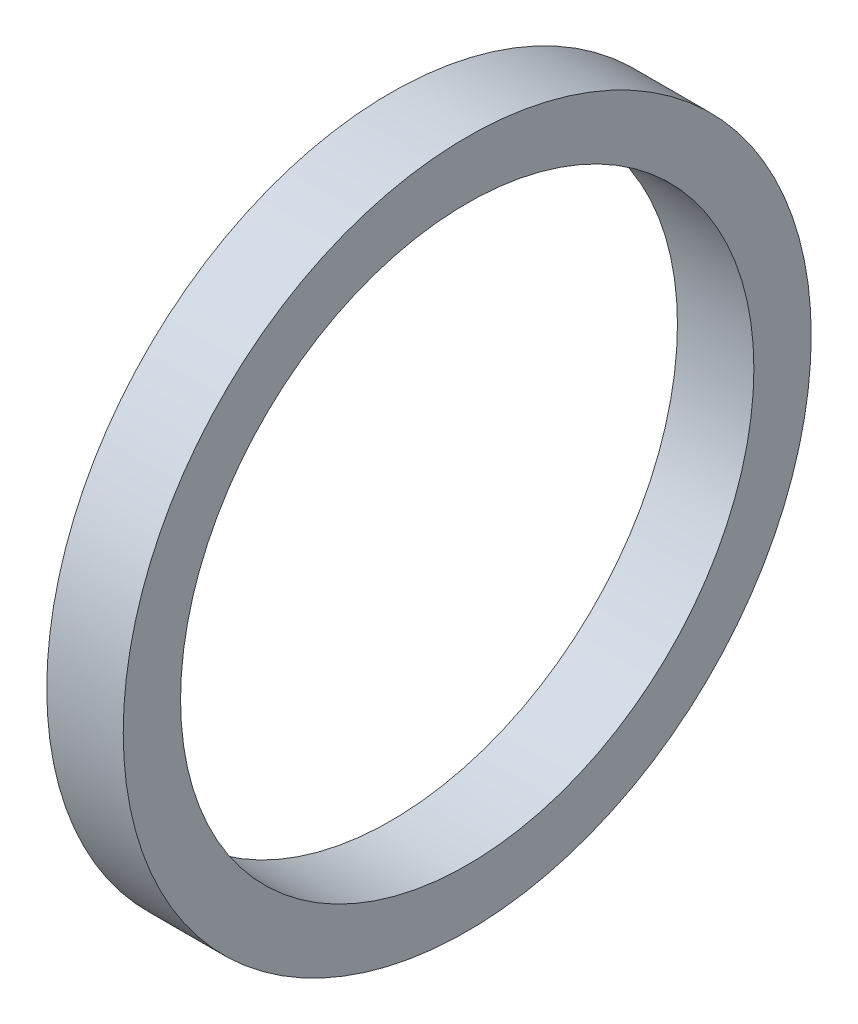
ISO-10303-21;
HEADER;
FILE_DESCRIPTION(('STEP AP214'),'2;1');
FILE_NAME('part.step','',(''),(''),'','','');
FILE_SCHEMA(('AUTOMOTIVE_DESIGN { 1 0 10303 214 1 1 1 1 }'));
ENDSEC;
DATA;
#1=APPLICATION_CONTEXT('core data for automotive mechanical design processes');
#2=APPLICATION_PROTOCOL_DEFINITION('international standard','automotive_design',2000,#1);
#3=PRODUCT_CONTEXT('',#1,'mechanical');
#4=PRODUCT('Part','Part','',(#3));
#5=PRODUCT_RELATED_PRODUCT_CATEGORY('part','',(#4));
#6=PRODUCT_DEFINITION_FORMATION('','',#4);
#7=PRODUCT_DEFINITION_CONTEXT('part definition',#1,'design');
#8=PRODUCT_DEFINITION('design','',#6,#7);
#9=PRODUCT_DEFINITION_SHAPE('','',#8);
#10=(LENGTH_UNIT() NAMED_UNIT(*) SI_UNIT(.MILLI.,.METRE.));
#11=(NAMED_UNIT(*) PLANE_ANGLE_UNIT() SI_UNIT($,.RADIAN.));
#12=(NAMED_UNIT(*) SI_UNIT($,.STERADIAN.) SOLID_ANGLE_UNIT());
#13=UNCERTAINTY_MEASURE_WITH_UNIT(LENGTH_MEASURE(1.E-05),#10,'distance_accuracy_value','');
#14=(GEOMETRIC_REPRESENTATION_CONTEXT(3) GLOBAL_UNCERTAINTY_ASSIGNED_CONTEXT((#13)) GLOBAL_UNIT_ASSIGNED_CONTEXT((#10,
#11,#12)) REPRESENTATION_CONTEXT('',''));
#15=CARTESIAN_POINT('',(0.,0.,0.));
#16=DIRECTION('',(0.,0.,1.));
#17=DIRECTION('',(1.,0.,0.));
#18=AXIS2_PLACEMENT_3D('',#15,#16,#17);
#19=CARTESIAN_POINT('',(0.,45.,0.));
#20=DIRECTION('',(1.,0.,0.));
#21=DIRECTION('',(0.,0.,-1.));
#22=AXIS2_PLACEMENT_3D('',#19,#20,#21);
#23=PLANE('',#22);
#24=CARTESIAN_POINT('',(0.,0.,0.));
#25=DIRECTION('',(-1.,0.,0.));
#26=DIRECTION('',(0.,0.,1.));
#27=AXIS2_PLACEMENT_3D('',#24,#25,#26);
#28=CIRCLE('',#27,37.5);
#29=CARTESIAN_POINT('',(0.,0.,37.5));
#30=VERTEX_POINT('',#29);
#31=EDGE_CURVE('E10',#30,#30,#28,.T.);
#32=ORIENTED_EDGE('',*,*,#31,.F.);
#33=EDGE_LOOP('',(#32));
#34=FACE_BOUND('',#33,.T.);
#35=CARTESIAN_POINT('',(0.,0.,0.));
#36=DIRECTION('',(-1.,0.,0.));
#37=DIRECTION('',(0.,0.,1.));
#38=AXIS2_PLACEMENT_3D('',#35,#36,#37);
#39=CIRCLE('',#38,45.);
#40=CARTESIAN_POINT('',(0.,0.,45.));
#41=VERTEX_POINT('',#40);
#42=EDGE_CURVE('E54',#41,#41,#39,.T.);
#43=ORIENTED_EDGE('',*,*,#42,.T.);
#44=EDGE_LOOP('',(#43));
#45=FACE_BOUND('',#44,.T.);
#46=ADVANCED_FACE('F41',(#34,#45),#23,.F.);
#47=CARTESIAN_POINT('',(-59.6592581066923,0.,0.));
#48=DIRECTION('',(-1.,0.,0.));
#49=DIRECTION('',(0.,0.,1.));
#50=AXIS2_PLACEMENT_3D('',#47,#48,#49);
#51=CYLINDRICAL_SURFACE('',#50,37.5);
#52=CARTESIAN_POINT('',(10.,0.,0.));
#53=DIRECTION('',(-1.,0.,0.));
#54=DIRECTION('',(0.,0.,1.));
#55=AXIS2_PLACEMENT_3D('',#52,#53,#54);
#56=CIRCLE('',#55,37.5);
#57=CARTESIAN_POINT('',(10.,0.,37.5));
#58=VERTEX_POINT('',#57);
#59=EDGE_CURVE('E50',#58,#58,#56,.T.);
#60=ORIENTED_EDGE('',*,*,#59,.F.);
#61=EDGE_LOOP('',(#60));
#62=FACE_BOUND('',#61,.T.);
#63=ORIENTED_EDGE('',*,*,#31,.T.);
#64=EDGE_LOOP('',(#63));
#65=FACE_BOUND('',#64,.T.);
#66=ADVANCED_FACE('F67',(#62,#65),#51,.F.);
#67=CARTESIAN_POINT('',(10.,37.5,0.));
#68=DIRECTION('',(-1.,0.,0.));
#69=DIRECTION('',(0.,0.,1.));
#70=AXIS2_PLACEMENT_3D('',#67,#68,#69);
#71=PLANE('',#70);
#72=CARTESIAN_POINT('',(10.,0.,0.));
#73=DIRECTION('',(-1.,0.,0.));
#74=DIRECTION('',(0.,0.,1.));
#75=AXIS2_PLACEMENT_3D('',#72,#73,#74);
#76=CIRCLE('',#75,45.);
#77=CARTESIAN_POINT('',(10.,0.,45.));
#78=VERTEX_POINT('',#77);
#79=EDGE_CURVE('E51',#78,#78,#76,.T.);
#80=ORIENTED_EDGE('',*,*,#79,.F.);
#81=EDGE_LOOP('',(#80));
#82=FACE_BOUND('',#81,.T.);
#83=ORIENTED_EDGE('',*,*,#59,.T.);
#84=EDGE_LOOP('',(#83));
#85=FACE_BOUND('',#84,.T.);
#86=ADVANCED_FACE('F65',(#82,#85),#71,.F.);
#87=CARTESIAN_POINT('',(-59.6592581066923,0.,0.));
#88=DIRECTION('',(-1.,0.,0.));
#89=DIRECTION('',(0.,0.,1.));
#90=AXIS2_PLACEMENT_3D('',#87,#88,#89);
#91=CYLINDRICAL_SURFACE('',#90,45.);
#92=ORIENTED_EDGE('',*,*,#42,.F.);
#93=EDGE_LOOP('',(#92));
#94=FACE_BOUND('',#93,.T.);
#95=ORIENTED_EDGE('',*,*,#79,.T.);
#96=EDGE_LOOP('',(#95));
#97=FACE_BOUND('',#96,.T.);
#98=ADVANCED_FACE('F62',(#94,#97),#91,.T.);
#99=CLOSED_SHELL('',(#46,#66,#86,#98));
#100=MANIFOLD_SOLID_BREP('B2',#99);
#101=ADVANCED_BREP_SHAPE_REPRESENTATION('',(#18,#100),#14);
#102=SHAPE_DEFINITION_REPRESENTATION(#9,#101);
ENDSEC;
END-ISO-10303-21;
